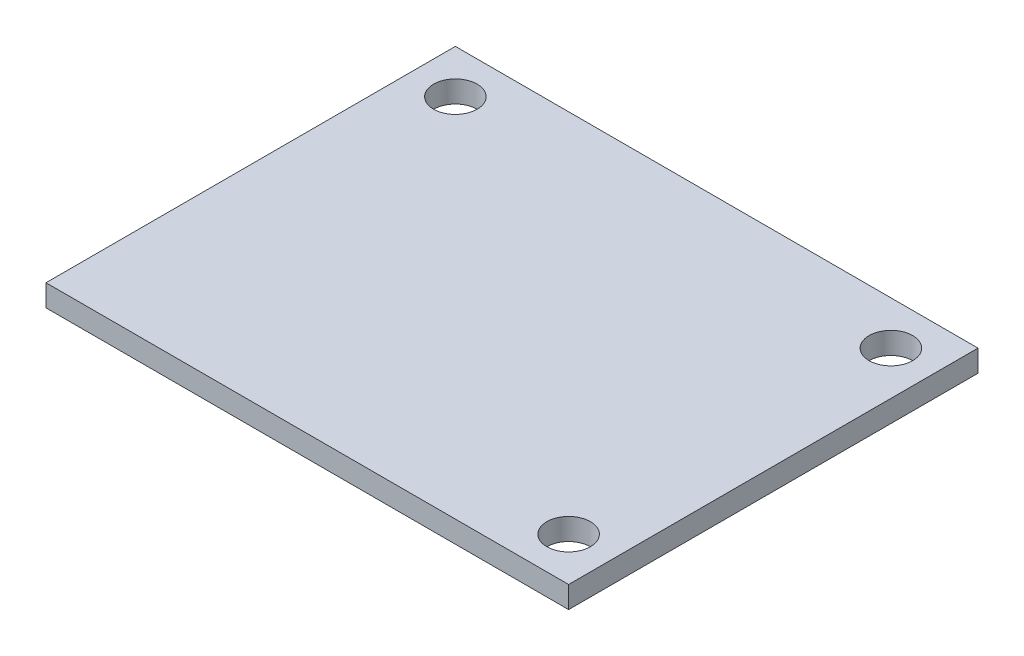
ISO-10303-21;
HEADER;
FILE_DESCRIPTION(('STEP AP214'),'2;1');
FILE_NAME('part.step','',(''),(''),'','','');
FILE_SCHEMA(('AUTOMOTIVE_DESIGN { 1 0 10303 214 1 1 1 1 }'));
ENDSEC;
DATA;
#1=APPLICATION_CONTEXT('core data for automotive mechanical design processes');
#2=APPLICATION_PROTOCOL_DEFINITION('international standard','automotive_design',2000,#1);
#3=PRODUCT_CONTEXT('',#1,'mechanical');
#4=PRODUCT('Part','Part','',(#3));
#5=PRODUCT_RELATED_PRODUCT_CATEGORY('part','',(#4));
#6=PRODUCT_DEFINITION_FORMATION('','',#4);
#7=PRODUCT_DEFINITION_CONTEXT('part definition',#1,'design');
#8=PRODUCT_DEFINITION('design','',#6,#7);
#9=PRODUCT_DEFINITION_SHAPE('','',#8);
#10=(LENGTH_UNIT() NAMED_UNIT(*) SI_UNIT(.MILLI.,.METRE.));
#11=(NAMED_UNIT(*) PLANE_ANGLE_UNIT() SI_UNIT($,.RADIAN.));
#12=(NAMED_UNIT(*) SI_UNIT($,.STERADIAN.) SOLID_ANGLE_UNIT());
#13=UNCERTAINTY_MEASURE_WITH_UNIT(LENGTH_MEASURE(1.E-05),#10,'distance_accuracy_value','');
#14=(GEOMETRIC_REPRESENTATION_CONTEXT(3) GLOBAL_UNCERTAINTY_ASSIGNED_CONTEXT((#13)) GLOBAL_UNIT_ASSIGNED_CONTEXT((#10,
#11,#12)) REPRESENTATION_CONTEXT('',''));
#15=CARTESIAN_POINT('',(0.,0.,0.));
#16=DIRECTION('',(0.,0.,1.));
#17=DIRECTION('',(1.,0.,0.));
#18=AXIS2_PLACEMENT_3D('',#15,#16,#17);
#19=CARTESIAN_POINT('',(19.05,1.5875,14.9225));
#20=DIRECTION('',(-1.,0.,0.));
#21=DIRECTION('',(0.,0.,1.));
#22=AXIS2_PLACEMENT_3D('',#19,#20,#21);
#23=PLANE('',#22);
#24=DIRECTION('',(0.,0.,-1.));
#25=VECTOR('',#24,1.);
#26=CARTESIAN_POINT('',(19.05,0.,14.9225));
#27=LINE('',#26,#25);
#28=CARTESIAN_POINT('',(19.05,0.,14.9225));
#29=VERTEX_POINT('',#28);
#30=CARTESIAN_POINT('',(19.05,0.,-14.9225));
#31=VERTEX_POINT('',#30);
#32=EDGE_CURVE('E98',#29,#31,#27,.T.);
#33=ORIENTED_EDGE('',*,*,#32,.T.);
#34=DIRECTION('',(0.,-1.,0.));
#35=VECTOR('',#34,1.);
#36=CARTESIAN_POINT('',(19.05,1.5875,-14.9225));
#37=LINE('',#36,#35);
#38=CARTESIAN_POINT('',(19.05,1.5875,-14.9225));
#39=VERTEX_POINT('',#38);
#40=EDGE_CURVE('E11',#39,#31,#37,.T.);
#41=ORIENTED_EDGE('',*,*,#40,.F.);
#42=DIRECTION('',(0.,0.,-1.));
#43=VECTOR('',#42,1.);
#44=CARTESIAN_POINT('',(19.05,1.5875,14.9225));
#45=LINE('',#44,#43);
#46=CARTESIAN_POINT('',(19.05,1.5875,14.9225));
#47=VERTEX_POINT('',#46);
#48=EDGE_CURVE('E86',#47,#39,#45,.T.);
#49=ORIENTED_EDGE('',*,*,#48,.F.);
#50=DIRECTION('',(0.,-1.,0.));
#51=VECTOR('',#50,1.);
#52=CARTESIAN_POINT('',(19.05,1.5875,14.9225));
#53=LINE('',#52,#51);
#54=EDGE_CURVE('E94',#47,#29,#53,.T.);
#55=ORIENTED_EDGE('',*,*,#54,.T.);
#56=EDGE_LOOP('',(#33,#41,#49,#55));
#57=FACE_BOUND('',#56,.T.);
#58=ADVANCED_FACE('F35',(#57),#23,.F.);
#59=CARTESIAN_POINT('',(-19.05,1.5875,-14.9225));
#60=DIRECTION('',(0.,0.,1.));
#61=DIRECTION('',(1.,0.,0.));
#62=AXIS2_PLACEMENT_3D('',#59,#60,#61);
#63=PLANE('',#62);
#64=DIRECTION('',(-1.,0.,0.));
#65=VECTOR('',#64,1.);
#66=CARTESIAN_POINT('',(-19.05,0.,-14.9225));
#67=LINE('',#66,#65);
#68=CARTESIAN_POINT('',(-19.05,0.,-14.9225));
#69=VERTEX_POINT('',#68);
#70=EDGE_CURVE('E90',#31,#69,#67,.T.);
#71=ORIENTED_EDGE('',*,*,#70,.T.);
#72=DIRECTION('',(0.,-1.,0.));
#73=VECTOR('',#72,1.);
#74=CARTESIAN_POINT('',(-19.05,1.5875,-14.9225));
#75=LINE('',#74,#73);
#76=CARTESIAN_POINT('',(-19.05,1.5875,-14.9225));
#77=VERTEX_POINT('',#76);
#78=EDGE_CURVE('E43',#77,#69,#75,.T.);
#79=ORIENTED_EDGE('',*,*,#78,.F.);
#80=DIRECTION('',(-1.,0.,0.));
#81=VECTOR('',#80,1.);
#82=CARTESIAN_POINT('',(-19.05,1.5875,-14.9225));
#83=LINE('',#82,#81);
#84=EDGE_CURVE('E81',#39,#77,#83,.T.);
#85=ORIENTED_EDGE('',*,*,#84,.F.);
#86=ORIENTED_EDGE('',*,*,#40,.T.);
#87=EDGE_LOOP('',(#71,#79,#85,#86));
#88=FACE_BOUND('',#87,.T.);
#89=ADVANCED_FACE('F89',(#88),#63,.F.);
#90=CARTESIAN_POINT('',(-19.05,1.5875,14.9225));
#91=DIRECTION('',(1.,0.,0.));
#92=DIRECTION('',(0.,0.,-1.));
#93=AXIS2_PLACEMENT_3D('',#90,#91,#92);
#94=PLANE('',#93);
#95=DIRECTION('',(0.,0.,1.));
#96=VECTOR('',#95,1.);
#97=CARTESIAN_POINT('',(-19.05,0.,14.9225));
#98=LINE('',#97,#96);
#99=CARTESIAN_POINT('',(-19.05,0.,14.9225));
#100=VERTEX_POINT('',#99);
#101=EDGE_CURVE('E68',#69,#100,#98,.T.);
#102=ORIENTED_EDGE('',*,*,#101,.T.);
#103=DIRECTION('',(0.,-1.,0.));
#104=VECTOR('',#103,1.);
#105=CARTESIAN_POINT('',(-19.05,1.5875,14.9225));
#106=LINE('',#105,#104);
#107=CARTESIAN_POINT('',(-19.05,1.5875,14.9225));
#108=VERTEX_POINT('',#107);
#109=EDGE_CURVE('E91',#108,#100,#106,.T.);
#110=ORIENTED_EDGE('',*,*,#109,.F.);
#111=DIRECTION('',(0.,0.,1.));
#112=VECTOR('',#111,1.);
#113=CARTESIAN_POINT('',(-19.05,1.5875,14.9225));
#114=LINE('',#113,#112);
#115=EDGE_CURVE('E84',#77,#108,#114,.T.);
#116=ORIENTED_EDGE('',*,*,#115,.F.);
#117=ORIENTED_EDGE('',*,*,#78,.T.);
#118=EDGE_LOOP('',(#102,#110,#116,#117));
#119=FACE_BOUND('',#118,.T.);
#120=ADVANCED_FACE('F92',(#119),#94,.F.);
#121=CARTESIAN_POINT('',(-19.05,1.5875,14.9225));
#122=DIRECTION('',(0.,0.,-1.));
#123=DIRECTION('',(-1.,0.,0.));
#124=AXIS2_PLACEMENT_3D('',#121,#122,#123);
#125=PLANE('',#124);
#126=DIRECTION('',(1.,0.,0.));
#127=VECTOR('',#126,1.);
#128=CARTESIAN_POINT('',(-19.05,0.,14.9225));
#129=LINE('',#128,#127);
#130=EDGE_CURVE('E74',#100,#29,#129,.T.);
#131=ORIENTED_EDGE('',*,*,#130,.T.);
#132=ORIENTED_EDGE('',*,*,#54,.F.);
#133=DIRECTION('',(1.,0.,0.));
#134=VECTOR('',#133,1.);
#135=CARTESIAN_POINT('',(-19.05,1.5875,14.9225));
#136=LINE('',#135,#134);
#137=EDGE_CURVE('E51',#108,#47,#136,.T.);
#138=ORIENTED_EDGE('',*,*,#137,.F.);
#139=ORIENTED_EDGE('',*,*,#109,.T.);
#140=EDGE_LOOP('',(#131,#132,#138,#139));
#141=FACE_BOUND('',#140,.T.);
#142=ADVANCED_FACE('F106',(#141),#125,.F.);
#143=CARTESIAN_POINT('',(0.,1.5875,0.));
#144=DIRECTION('',(0.,-1.,0.));
#145=DIRECTION('',(0.,0.,-1.));
#146=AXIS2_PLACEMENT_3D('',#143,#144,#145);
#147=PLANE('',#146);
#148=CARTESIAN_POINT('',(-15.875,1.5875,-11.7475));
#149=DIRECTION('',(0.,1.,0.));
#150=DIRECTION('',(0.,0.,1.));
#151=AXIS2_PLACEMENT_3D('',#148,#149,#150);
#152=CIRCLE('',#151,1.5875);
#153=CARTESIAN_POINT('',(-15.875,1.5875,-10.16));
#154=VERTEX_POINT('',#153);
#155=EDGE_CURVE('E124',#154,#154,#152,.T.);
#156=ORIENTED_EDGE('',*,*,#155,.F.);
#157=EDGE_LOOP('',(#156));
#158=FACE_BOUND('',#157,.T.);
#159=CARTESIAN_POINT('',(15.875,1.5875,-11.7475));
#160=DIRECTION('',(0.,1.,0.));
#161=DIRECTION('',(0.,0.,1.));
#162=AXIS2_PLACEMENT_3D('',#159,#160,#161);
#163=CIRCLE('',#162,1.5875);
#164=CARTESIAN_POINT('',(15.875,1.5875,-10.16));
#165=VERTEX_POINT('',#164);
#166=EDGE_CURVE('E118',#165,#165,#163,.T.);
#167=ORIENTED_EDGE('',*,*,#166,.F.);
#168=EDGE_LOOP('',(#167));
#169=FACE_BOUND('',#168,.T.);
#170=CARTESIAN_POINT('',(15.875,1.5875,11.7475));
#171=DIRECTION('',(0.,1.,0.));
#172=DIRECTION('',(0.,0.,1.));
#173=AXIS2_PLACEMENT_3D('',#170,#171,#172);
#174=CIRCLE('',#173,1.5875);
#175=CARTESIAN_POINT('',(15.875,1.5875,13.335));
#176=VERTEX_POINT('',#175);
#177=EDGE_CURVE('E112',#176,#176,#174,.T.);
#178=ORIENTED_EDGE('',*,*,#177,.F.);
#179=EDGE_LOOP('',(#178));
#180=FACE_BOUND('',#179,.T.);
#181=ORIENTED_EDGE('',*,*,#48,.T.);
#182=ORIENTED_EDGE('',*,*,#84,.T.);
#183=ORIENTED_EDGE('',*,*,#115,.T.);
#184=ORIENTED_EDGE('',*,*,#137,.T.);
#185=EDGE_LOOP('',(#181,#182,#183,#184));
#186=FACE_BOUND('',#185,.T.);
#187=ADVANCED_FACE('F82',(#158,#169,#180,#186),#147,.F.);
#188=CARTESIAN_POINT('',(0.,0.,0.));
#189=DIRECTION('',(0.,-1.,0.));
#190=DIRECTION('',(0.,0.,-1.));
#191=AXIS2_PLACEMENT_3D('',#188,#189,#190);
#192=PLANE('',#191);
#193=CARTESIAN_POINT('',(-15.875,0.,-11.7475));
#194=DIRECTION('',(0.,1.,0.));
#195=DIRECTION('',(0.,0.,1.));
#196=AXIS2_PLACEMENT_3D('',#193,#194,#195);
#197=CIRCLE('',#196,1.5875);
#198=CARTESIAN_POINT('',(-15.875,0.,-10.16));
#199=VERTEX_POINT('',#198);
#200=EDGE_CURVE('E101',#199,#199,#197,.T.);
#201=ORIENTED_EDGE('',*,*,#200,.T.);
#202=EDGE_LOOP('',(#201));
#203=FACE_BOUND('',#202,.T.);
#204=CARTESIAN_POINT('',(15.875,0.,-11.7475));
#205=DIRECTION('',(0.,1.,0.));
#206=DIRECTION('',(0.,0.,1.));
#207=AXIS2_PLACEMENT_3D('',#204,#205,#206);
#208=CIRCLE('',#207,1.5875);
#209=CARTESIAN_POINT('',(15.875,0.,-10.16));
#210=VERTEX_POINT('',#209);
#211=EDGE_CURVE('E121',#210,#210,#208,.T.);
#212=ORIENTED_EDGE('',*,*,#211,.T.);
#213=EDGE_LOOP('',(#212));
#214=FACE_BOUND('',#213,.T.);
#215=CARTESIAN_POINT('',(15.875,0.,11.7475));
#216=DIRECTION('',(0.,1.,0.));
#217=DIRECTION('',(0.,0.,1.));
#218=AXIS2_PLACEMENT_3D('',#215,#216,#217);
#219=CIRCLE('',#218,1.5875);
#220=CARTESIAN_POINT('',(15.875,0.,13.335));
#221=VERTEX_POINT('',#220);
#222=EDGE_CURVE('E115',#221,#221,#219,.T.);
#223=ORIENTED_EDGE('',*,*,#222,.T.);
#224=EDGE_LOOP('',(#223));
#225=FACE_BOUND('',#224,.T.);
#226=ORIENTED_EDGE('',*,*,#32,.F.);
#227=ORIENTED_EDGE('',*,*,#130,.F.);
#228=ORIENTED_EDGE('',*,*,#101,.F.);
#229=ORIENTED_EDGE('',*,*,#70,.F.);
#230=EDGE_LOOP('',(#226,#227,#228,#229));
#231=FACE_BOUND('',#230,.T.);
#232=ADVANCED_FACE('F109',(#203,#214,#225,#231),#192,.T.);
#233=CARTESIAN_POINT('',(15.875,0.,11.7475));
#234=DIRECTION('',(0.,1.,0.));
#235=DIRECTION('',(0.,0.,1.));
#236=AXIS2_PLACEMENT_3D('',#233,#234,#235);
#237=CYLINDRICAL_SURFACE('',#236,1.5875);
#238=ORIENTED_EDGE('',*,*,#222,.F.);
#239=EDGE_LOOP('',(#238));
#240=FACE_BOUND('',#239,.T.);
#241=ORIENTED_EDGE('',*,*,#177,.T.);
#242=EDGE_LOOP('',(#241));
#243=FACE_BOUND('',#242,.T.);
#244=ADVANCED_FACE('F146',(#240,#243),#237,.F.);
#245=CARTESIAN_POINT('',(15.875,0.,-11.7475));
#246=DIRECTION('',(0.,1.,0.));
#247=DIRECTION('',(0.,0.,1.));
#248=AXIS2_PLACEMENT_3D('',#245,#246,#247);
#249=CYLINDRICAL_SURFACE('',#248,1.5875);
#250=ORIENTED_EDGE('',*,*,#211,.F.);
#251=EDGE_LOOP('',(#250));
#252=FACE_BOUND('',#251,.T.);
#253=ORIENTED_EDGE('',*,*,#166,.T.);
#254=EDGE_LOOP('',(#253));
#255=FACE_BOUND('',#254,.T.);
#256=ADVANCED_FACE('F135',(#252,#255),#249,.F.);
#257=CARTESIAN_POINT('',(-15.875,0.,-11.7475));
#258=DIRECTION('',(0.,1.,0.));
#259=DIRECTION('',(0.,0.,1.));
#260=AXIS2_PLACEMENT_3D('',#257,#258,#259);
#261=CYLINDRICAL_SURFACE('',#260,1.5875);
#262=ORIENTED_EDGE('',*,*,#200,.F.);
#263=EDGE_LOOP('',(#262));
#264=FACE_BOUND('',#263,.T.);
#265=ORIENTED_EDGE('',*,*,#155,.T.);
#266=EDGE_LOOP('',(#265));
#267=FACE_BOUND('',#266,.T.);
#268=ADVANCED_FACE('F132',(#264,#267),#261,.F.);
#269=CLOSED_SHELL('',(#58,#89,#120,#142,#187,#232,#244,#256,#268));
#270=MANIFOLD_SOLID_BREP('B2',#269);
#271=ADVANCED_BREP_SHAPE_REPRESENTATION('',(#18,#270),#14);
#272=SHAPE_DEFINITION_REPRESENTATION(#9,#271);
ENDSEC;
END-ISO-10303-21;
